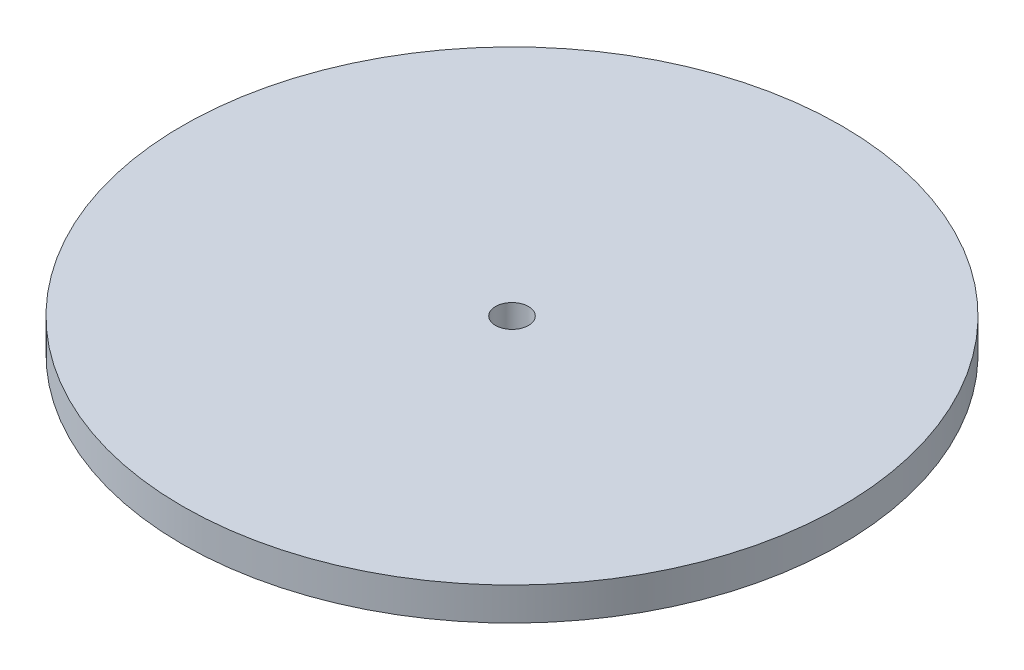
ISO-10303-21;
HEADER;
FILE_DESCRIPTION(('STEP AP214'),'2;1');
FILE_NAME('part.step','',(''),(''),'','','');
FILE_SCHEMA(('AUTOMOTIVE_DESIGN { 1 0 10303 214 1 1 1 1 }'));
ENDSEC;
DATA;
#1=APPLICATION_CONTEXT('core data for automotive mechanical design processes');
#2=APPLICATION_PROTOCOL_DEFINITION('international standard','automotive_design',2000,#1);
#3=PRODUCT_CONTEXT('',#1,'mechanical');
#4=PRODUCT('Part','Part','',(#3));
#5=PRODUCT_RELATED_PRODUCT_CATEGORY('part','',(#4));
#6=PRODUCT_DEFINITION_FORMATION('','',#4);
#7=PRODUCT_DEFINITION_CONTEXT('part definition',#1,'design');
#8=PRODUCT_DEFINITION('design','',#6,#7);
#9=PRODUCT_DEFINITION_SHAPE('','',#8);
#10=(LENGTH_UNIT() NAMED_UNIT(*) SI_UNIT(.MILLI.,.METRE.));
#11=(NAMED_UNIT(*) PLANE_ANGLE_UNIT() SI_UNIT($,.RADIAN.));
#12=(NAMED_UNIT(*) SI_UNIT($,.STERADIAN.) SOLID_ANGLE_UNIT());
#13=UNCERTAINTY_MEASURE_WITH_UNIT(LENGTH_MEASURE(1.E-05),#10,'distance_accuracy_value','');
#14=(GEOMETRIC_REPRESENTATION_CONTEXT(3) GLOBAL_UNCERTAINTY_ASSIGNED_CONTEXT((#13)) GLOBAL_UNIT_ASSIGNED_CONTEXT((#10,
#11,#12)) REPRESENTATION_CONTEXT('',''));
#15=CARTESIAN_POINT('',(0.,0.,0.));
#16=DIRECTION('',(0.,0.,1.));
#17=DIRECTION('',(1.,0.,0.));
#18=AXIS2_PLACEMENT_3D('',#15,#16,#17);
#19=CARTESIAN_POINT('',(0.,10.16,0.));
#20=DIRECTION('',(0.,-1.,0.));
#21=DIRECTION('',(0.,0.,-1.));
#22=AXIS2_PLACEMENT_3D('',#19,#20,#21);
#23=CYLINDRICAL_SURFACE('',#22,101.6);
#24=CARTESIAN_POINT('',(0.,10.16,0.));
#25=DIRECTION('',(0.,1.,0.));
#26=DIRECTION('',(0.,0.,1.));
#27=AXIS2_PLACEMENT_3D('',#24,#25,#26);
#28=CIRCLE('',#27,101.6);
#29=CARTESIAN_POINT('',(0.,10.16,101.6));
#30=VERTEX_POINT('',#29);
#31=EDGE_CURVE('E10',#30,#30,#28,.T.);
#32=ORIENTED_EDGE('',*,*,#31,.F.);
#33=EDGE_LOOP('',(#32));
#34=FACE_BOUND('',#33,.T.);
#35=CARTESIAN_POINT('',(0.,0.,0.));
#36=DIRECTION('',(0.,1.,0.));
#37=DIRECTION('',(0.,0.,1.));
#38=AXIS2_PLACEMENT_3D('',#35,#36,#37);
#39=CIRCLE('',#38,101.6);
#40=CARTESIAN_POINT('',(0.,0.,101.6));
#41=VERTEX_POINT('',#40);
#42=EDGE_CURVE('E34',#41,#41,#39,.T.);
#43=ORIENTED_EDGE('',*,*,#42,.T.);
#44=EDGE_LOOP('',(#43));
#45=FACE_BOUND('',#44,.T.);
#46=ADVANCED_FACE('F31',(#34,#45),#23,.T.);
#47=CARTESIAN_POINT('',(0.,10.16,0.));
#48=DIRECTION('',(0.,1.,0.));
#49=DIRECTION('',(0.,0.,1.));
#50=AXIS2_PLACEMENT_3D('',#47,#48,#49);
#51=PLANE('',#50);
#52=CARTESIAN_POINT('',(0.,10.16,0.));
#53=DIRECTION('',(0.,1.,0.));
#54=DIRECTION('',(0.,0.,1.));
#55=AXIS2_PLACEMENT_3D('',#52,#53,#54);
#56=CIRCLE('',#55,5.08);
#57=CARTESIAN_POINT('',(0.,10.16,5.08));
#58=VERTEX_POINT('',#57);
#59=EDGE_CURVE('E43',#58,#58,#56,.T.);
#60=ORIENTED_EDGE('',*,*,#59,.F.);
#61=EDGE_LOOP('',(#60));
#62=FACE_BOUND('',#61,.T.);
#63=ORIENTED_EDGE('',*,*,#31,.T.);
#64=EDGE_LOOP('',(#63));
#65=FACE_BOUND('',#64,.T.);
#66=ADVANCED_FACE('F58',(#62,#65),#51,.T.);
#67=CARTESIAN_POINT('',(0.,0.,0.));
#68=DIRECTION('',(0.,1.,0.));
#69=DIRECTION('',(0.,0.,1.));
#70=AXIS2_PLACEMENT_3D('',#67,#68,#69);
#71=PLANE('',#70);
#72=CARTESIAN_POINT('',(0.,0.,0.));
#73=DIRECTION('',(0.,1.,0.));
#74=DIRECTION('',(0.,0.,1.));
#75=AXIS2_PLACEMENT_3D('',#72,#73,#74);
#76=CIRCLE('',#75,5.08);
#77=CARTESIAN_POINT('',(0.,0.,5.08));
#78=VERTEX_POINT('',#77);
#79=EDGE_CURVE('E41',#78,#78,#76,.T.);
#80=ORIENTED_EDGE('',*,*,#79,.T.);
#81=EDGE_LOOP('',(#80));
#82=FACE_BOUND('',#81,.T.);
#83=ORIENTED_EDGE('',*,*,#42,.F.);
#84=EDGE_LOOP('',(#83));
#85=FACE_BOUND('',#84,.T.);
#86=ADVANCED_FACE('F49',(#82,#85),#71,.F.);
#87=CARTESIAN_POINT('',(0.,0.,0.));
#88=DIRECTION('',(0.,1.,0.));
#89=DIRECTION('',(0.,0.,1.));
#90=AXIS2_PLACEMENT_3D('',#87,#88,#89);
#91=CYLINDRICAL_SURFACE('',#90,5.08);
#92=ORIENTED_EDGE('',*,*,#79,.F.);
#93=EDGE_LOOP('',(#92));
#94=FACE_BOUND('',#93,.T.);
#95=ORIENTED_EDGE('',*,*,#59,.T.);
#96=EDGE_LOOP('',(#95));
#97=FACE_BOUND('',#96,.T.);
#98=ADVANCED_FACE('F52',(#94,#97),#91,.F.);
#99=CLOSED_SHELL('',(#46,#66,#86,#98));
#100=MANIFOLD_SOLID_BREP('B2',#99);
#101=ADVANCED_BREP_SHAPE_REPRESENTATION('',(#18,#100),#14);
#102=SHAPE_DEFINITION_REPRESENTATION(#9,#101);
ENDSEC;
END-ISO-10303-21;
